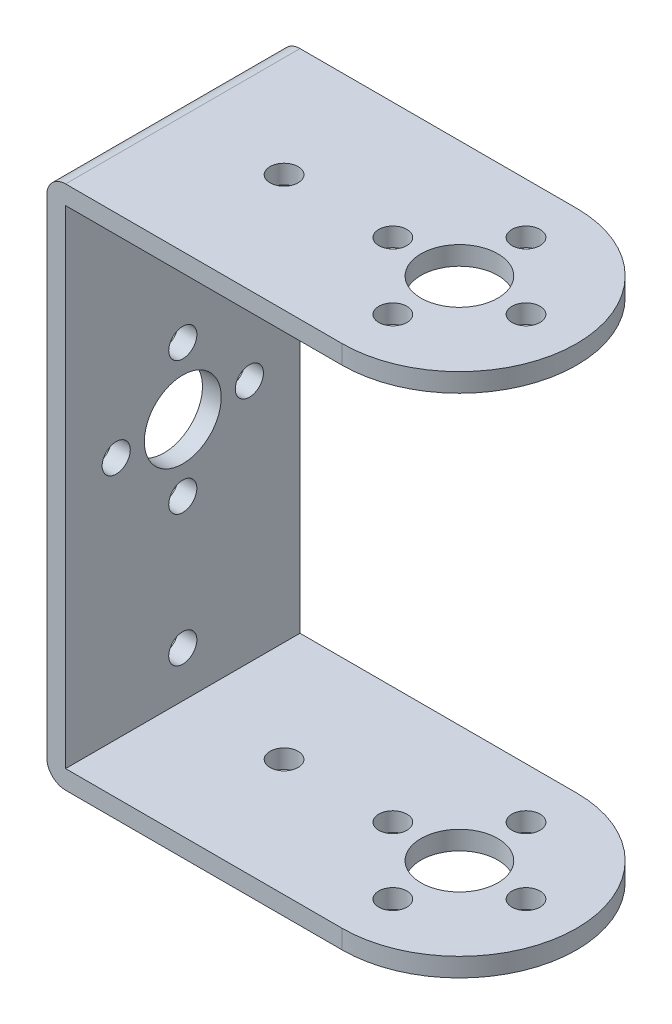
ISO-10303-21;
HEADER;
FILE_DESCRIPTION(('STEP AP214'),'2;1');
FILE_NAME('part.step','',(''),(''),'','','');
FILE_SCHEMA(('AUTOMOTIVE_DESIGN { 1 0 10303 214 1 1 1 1 }'));
ENDSEC;
DATA;
#1=APPLICATION_CONTEXT('core data for automotive mechanical design processes');
#2=APPLICATION_PROTOCOL_DEFINITION('international standard','automotive_design',2000,#1);
#3=PRODUCT_CONTEXT('',#1,'mechanical');
#4=PRODUCT('Part','Part','',(#3));
#5=PRODUCT_RELATED_PRODUCT_CATEGORY('part','',(#4));
#6=PRODUCT_DEFINITION_FORMATION('','',#4);
#7=PRODUCT_DEFINITION_CONTEXT('part definition',#1,'design');
#8=PRODUCT_DEFINITION('design','',#6,#7);
#9=PRODUCT_DEFINITION_SHAPE('','',#8);
#10=(LENGTH_UNIT() NAMED_UNIT(*) SI_UNIT(.MILLI.,.METRE.));
#11=(NAMED_UNIT(*) PLANE_ANGLE_UNIT() SI_UNIT($,.RADIAN.));
#12=(NAMED_UNIT(*) SI_UNIT($,.STERADIAN.) SOLID_ANGLE_UNIT());
#13=UNCERTAINTY_MEASURE_WITH_UNIT(LENGTH_MEASURE(1.E-05),#10,'distance_accuracy_value','');
#14=(GEOMETRIC_REPRESENTATION_CONTEXT(3) GLOBAL_UNCERTAINTY_ASSIGNED_CONTEXT((#13)) GLOBAL_UNIT_ASSIGNED_CONTEXT((#10,
#11,#12)) REPRESENTATION_CONTEXT('',''));
#15=CARTESIAN_POINT('',(0.,0.,0.));
#16=DIRECTION('',(0.,0.,1.));
#17=DIRECTION('',(1.,0.,0.));
#18=AXIS2_PLACEMENT_3D('',#15,#16,#17);
#19=CARTESIAN_POINT('',(-20.,-56.,-12.5));
#20=DIRECTION('',(1.,0.,0.));
#21=DIRECTION('',(0.,0.,-1.));
#22=AXIS2_PLACEMENT_3D('',#19,#20,#21);
#23=PLANE('',#22);
#24=CARTESIAN_POINT('',(-20.,-6.9,0.));
#25=DIRECTION('',(1.,0.,0.));
#26=DIRECTION('',(0.,0.,-1.));
#27=AXIS2_PLACEMENT_3D('',#24,#25,#26);
#28=CIRCLE('',#27,1.5);
#29=CARTESIAN_POINT('',(-20.,-6.9,-1.5));
#30=VERTEX_POINT('',#29);
#31=EDGE_CURVE('E473',#30,#30,#28,.F.);
#32=ORIENTED_EDGE('',*,*,#31,.T.);
#33=EDGE_LOOP('',(#32));
#34=FACE_BOUND('',#33,.T.);
#35=CARTESIAN_POINT('',(-20.,-28.,-7.1));
#36=DIRECTION('',(1.,0.,0.));
#37=DIRECTION('',(0.,0.,-1.));
#38=AXIS2_PLACEMENT_3D('',#35,#36,#37);
#39=CIRCLE('',#38,1.5);
#40=CARTESIAN_POINT('',(-20.,-28.,-8.6));
#41=VERTEX_POINT('',#40);
#42=EDGE_CURVE('E469',#41,#41,#39,.F.);
#43=ORIENTED_EDGE('',*,*,#42,.T.);
#44=EDGE_LOOP('',(#43));
#45=FACE_BOUND('',#44,.T.);
#46=CARTESIAN_POINT('',(-20.,-35.1,0.));
#47=DIRECTION('',(1.,0.,0.));
#48=DIRECTION('',(0.,0.,-1.));
#49=AXIS2_PLACEMENT_3D('',#46,#47,#48);
#50=CIRCLE('',#49,1.5);
#51=CARTESIAN_POINT('',(-20.,-35.1,-1.5));
#52=VERTEX_POINT('',#51);
#53=EDGE_CURVE('E463',#52,#52,#50,.F.);
#54=ORIENTED_EDGE('',*,*,#53,.T.);
#55=EDGE_LOOP('',(#54));
#56=FACE_BOUND('',#55,.T.);
#57=CARTESIAN_POINT('',(-20.,-28.,7.1));
#58=DIRECTION('',(1.,0.,0.));
#59=DIRECTION('',(0.,0.,-1.));
#60=AXIS2_PLACEMENT_3D('',#57,#58,#59);
#61=CIRCLE('',#60,1.5);
#62=CARTESIAN_POINT('',(-20.,-28.,5.6));
#63=VERTEX_POINT('',#62);
#64=EDGE_CURVE('E315',#63,#63,#61,.F.);
#65=ORIENTED_EDGE('',*,*,#64,.T.);
#66=EDGE_LOOP('',(#65));
#67=FACE_BOUND('',#66,.T.);
#68=CARTESIAN_POINT('',(-20.,-20.9,0.));
#69=DIRECTION('',(1.,0.,0.));
#70=DIRECTION('',(0.,0.,-1.));
#71=AXIS2_PLACEMENT_3D('',#68,#69,#70);
#72=CIRCLE('',#71,1.5);
#73=CARTESIAN_POINT('',(-20.,-20.9,-1.5));
#74=VERTEX_POINT('',#73);
#75=EDGE_CURVE('E480',#74,#74,#72,.F.);
#76=ORIENTED_EDGE('',*,*,#75,.T.);
#77=EDGE_LOOP('',(#76));
#78=FACE_BOUND('',#77,.T.);
#79=CARTESIAN_POINT('',(-20.,-49.1,0.));
#80=DIRECTION('',(1.,0.,0.));
#81=DIRECTION('',(0.,0.,-1.));
#82=AXIS2_PLACEMENT_3D('',#79,#80,#81);
#83=CIRCLE('',#82,1.5);
#84=CARTESIAN_POINT('',(-20.,-49.1,-1.5));
#85=VERTEX_POINT('',#84);
#86=EDGE_CURVE('E476',#85,#85,#83,.F.);
#87=ORIENTED_EDGE('',*,*,#86,.T.);
#88=EDGE_LOOP('',(#87));
#89=FACE_BOUND('',#88,.T.);
#90=CARTESIAN_POINT('',(-20.,-28.,0.));
#91=DIRECTION('',(1.,0.,0.));
#92=DIRECTION('',(0.,0.,-1.));
#93=AXIS2_PLACEMENT_3D('',#90,#91,#92);
#94=CIRCLE('',#93,4.1);
#95=CARTESIAN_POINT('',(-20.,-28.,-4.1));
#96=VERTEX_POINT('',#95);
#97=EDGE_CURVE('E307',#96,#96,#94,.F.);
#98=ORIENTED_EDGE('',*,*,#97,.T.);
#99=EDGE_LOOP('',(#98));
#100=FACE_BOUND('',#99,.T.);
#101=DIRECTION('',(0.,1.,0.));
#102=VECTOR('',#101,1.);
#103=CARTESIAN_POINT('',(-20.,-56.,12.5));
#104=LINE('',#103,#102);
#105=CARTESIAN_POINT('',(-20.,-54.,12.5));
#106=VERTEX_POINT('',#105);
#107=CARTESIAN_POINT('',(-20.,-2.,12.5));
#108=VERTEX_POINT('',#107);
#109=EDGE_CURVE('E185',#106,#108,#104,.T.);
#110=ORIENTED_EDGE('',*,*,#109,.F.);
#111=DIRECTION('',(0.,0.,-1.));
#112=VECTOR('',#111,1.);
#113=CARTESIAN_POINT('',(-20.,-54.,0.));
#114=LINE('',#113,#112);
#115=CARTESIAN_POINT('',(-20.,-54.,-12.5));
#116=VERTEX_POINT('',#115);
#117=EDGE_CURVE('E350',#106,#116,#114,.T.);
#118=ORIENTED_EDGE('',*,*,#117,.T.);
#119=DIRECTION('',(0.,1.,0.));
#120=VECTOR('',#119,1.);
#121=CARTESIAN_POINT('',(-20.,-56.,-12.5));
#122=LINE('',#121,#120);
#123=CARTESIAN_POINT('',(-20.,-2.,-12.5));
#124=VERTEX_POINT('',#123);
#125=EDGE_CURVE('E186',#116,#124,#122,.T.);
#126=ORIENTED_EDGE('',*,*,#125,.T.);
#127=DIRECTION('',(0.,0.,-1.));
#128=VECTOR('',#127,1.);
#129=CARTESIAN_POINT('',(-20.,-2.,0.));
#130=LINE('',#129,#128);
#131=EDGE_CURVE('E188',#108,#124,#130,.T.);
#132=ORIENTED_EDGE('',*,*,#131,.F.);
#133=EDGE_LOOP('',(#110,#118,#126,#132));
#134=FACE_BOUND('',#133,.T.);
#135=ADVANCED_FACE('F37',(#34,#45,#56,#67,#78,#89,#100,#134),#23,.T.);
#136=CARTESIAN_POINT('',(9.5,-2.,0.));
#137=DIRECTION('',(0.,1.,0.));
#138=DIRECTION('',(0.,0.,1.));
#139=AXIS2_PLACEMENT_3D('',#136,#137,#138);
#140=CYLINDRICAL_SURFACE('',#139,12.5);
#141=DIRECTION('',(0.,1.,0.));
#142=VECTOR('',#141,1.);
#143=CARTESIAN_POINT('',(9.5,-2.,12.5));
#144=LINE('',#143,#142);
#145=CARTESIAN_POINT('',(9.5,-2.,12.5));
#146=VERTEX_POINT('',#145);
#147=CARTESIAN_POINT('',(9.5,0.,12.5));
#148=VERTEX_POINT('',#147);
#149=EDGE_CURVE('E205',#146,#148,#144,.T.);
#150=ORIENTED_EDGE('',*,*,#149,.F.);
#151=CARTESIAN_POINT('',(9.5,-2.,0.));
#152=DIRECTION('',(0.,1.,0.));
#153=DIRECTION('',(0.,0.,1.));
#154=AXIS2_PLACEMENT_3D('',#151,#152,#153);
#155=CIRCLE('',#154,12.5);
#156=CARTESIAN_POINT('',(9.49999999999999,-2.,-12.5));
#157=VERTEX_POINT('',#156);
#158=EDGE_CURVE('E213',#157,#146,#155,.F.);
#159=ORIENTED_EDGE('',*,*,#158,.F.);
#160=DIRECTION('',(0.,1.,0.));
#161=VECTOR('',#160,1.);
#162=CARTESIAN_POINT('',(9.5,-2.,-12.5));
#163=LINE('',#162,#161);
#164=CARTESIAN_POINT('',(9.49999999999999,0.,-12.5));
#165=VERTEX_POINT('',#164);
#166=EDGE_CURVE('E210',#165,#157,#163,.F.);
#167=ORIENTED_EDGE('',*,*,#166,.F.);
#168=CARTESIAN_POINT('',(9.5,0.,0.));
#169=DIRECTION('',(0.,1.,0.));
#170=DIRECTION('',(0.,0.,1.));
#171=AXIS2_PLACEMENT_3D('',#168,#169,#170);
#172=CIRCLE('',#171,12.5);
#173=EDGE_CURVE('E215',#148,#165,#172,.T.);
#174=ORIENTED_EDGE('',*,*,#173,.F.);
#175=EDGE_LOOP('',(#150,#159,#167,#174));
#176=FACE_BOUND('',#175,.T.);
#177=ADVANCED_FACE('F247',(#176),#140,.T.);
#178=CARTESIAN_POINT('',(-22.,-2.,12.5));
#179=DIRECTION('',(-1.,0.,0.));
#180=DIRECTION('',(0.,0.,1.));
#181=AXIS2_PLACEMENT_3D('',#178,#179,#180);
#182=PLANE('',#181);
#183=CARTESIAN_POINT('',(-22.,-6.9,0.));
#184=DIRECTION('',(-1.,0.,0.));
#185=DIRECTION('',(0.,0.,1.));
#186=AXIS2_PLACEMENT_3D('',#183,#184,#185);
#187=CIRCLE('',#186,1.5);
#188=CARTESIAN_POINT('',(-22.,-6.9,1.5));
#189=VERTEX_POINT('',#188);
#190=EDGE_CURVE('E281',#189,#189,#187,.T.);
#191=ORIENTED_EDGE('',*,*,#190,.F.);
#192=EDGE_LOOP('',(#191));
#193=FACE_BOUND('',#192,.T.);
#194=CARTESIAN_POINT('',(-22.,-28.,-7.1));
#195=DIRECTION('',(-1.,0.,0.));
#196=DIRECTION('',(0.,0.,1.));
#197=AXIS2_PLACEMENT_3D('',#194,#195,#196);
#198=CIRCLE('',#197,1.5);
#199=CARTESIAN_POINT('',(-22.,-28.,-5.59999999999999));
#200=VERTEX_POINT('',#199);
#201=EDGE_CURVE('E285',#200,#200,#198,.T.);
#202=ORIENTED_EDGE('',*,*,#201,.F.);
#203=EDGE_LOOP('',(#202));
#204=FACE_BOUND('',#203,.T.);
#205=CARTESIAN_POINT('',(-22.,-35.1,0.));
#206=DIRECTION('',(-1.,0.,0.));
#207=DIRECTION('',(0.,0.,1.));
#208=AXIS2_PLACEMENT_3D('',#205,#206,#207);
#209=CIRCLE('',#208,1.5);
#210=CARTESIAN_POINT('',(-22.,-35.1,1.50000000000001));
#211=VERTEX_POINT('',#210);
#212=EDGE_CURVE('E289',#211,#211,#209,.T.);
#213=ORIENTED_EDGE('',*,*,#212,.F.);
#214=EDGE_LOOP('',(#213));
#215=FACE_BOUND('',#214,.T.);
#216=CARTESIAN_POINT('',(-22.,-28.,7.1));
#217=DIRECTION('',(-1.,0.,0.));
#218=DIRECTION('',(0.,0.,1.));
#219=AXIS2_PLACEMENT_3D('',#216,#217,#218);
#220=CIRCLE('',#219,1.5);
#221=CARTESIAN_POINT('',(-22.,-28.,8.6));
#222=VERTEX_POINT('',#221);
#223=EDGE_CURVE('E293',#222,#222,#220,.T.);
#224=ORIENTED_EDGE('',*,*,#223,.F.);
#225=EDGE_LOOP('',(#224));
#226=FACE_BOUND('',#225,.T.);
#227=CARTESIAN_POINT('',(-22.,-20.9,0.));
#228=DIRECTION('',(-1.,0.,0.));
#229=DIRECTION('',(0.,0.,1.));
#230=AXIS2_PLACEMENT_3D('',#227,#228,#229);
#231=CIRCLE('',#230,1.5);
#232=CARTESIAN_POINT('',(-22.,-20.9,1.5));
#233=VERTEX_POINT('',#232);
#234=EDGE_CURVE('E297',#233,#233,#231,.T.);
#235=ORIENTED_EDGE('',*,*,#234,.F.);
#236=EDGE_LOOP('',(#235));
#237=FACE_BOUND('',#236,.T.);
#238=CARTESIAN_POINT('',(-22.,-49.1,0.));
#239=DIRECTION('',(-1.,0.,0.));
#240=DIRECTION('',(0.,0.,-1.));
#241=AXIS2_PLACEMENT_3D('',#238,#239,#240);
#242=CIRCLE('',#241,1.5);
#243=CARTESIAN_POINT('',(-22.,-49.1,-1.5));
#244=VERTEX_POINT('',#243);
#245=EDGE_CURVE('E301',#244,#244,#242,.T.);
#246=ORIENTED_EDGE('',*,*,#245,.F.);
#247=EDGE_LOOP('',(#246));
#248=FACE_BOUND('',#247,.T.);
#249=CARTESIAN_POINT('',(-22.,-28.,0.));
#250=DIRECTION('',(-1.,0.,0.));
#251=DIRECTION('',(0.,0.,1.));
#252=AXIS2_PLACEMENT_3D('',#249,#250,#251);
#253=CIRCLE('',#252,4.1);
#254=CARTESIAN_POINT('',(-22.,-28.,4.1));
#255=VERTEX_POINT('',#254);
#256=EDGE_CURVE('E304',#255,#255,#253,.T.);
#257=ORIENTED_EDGE('',*,*,#256,.F.);
#258=EDGE_LOOP('',(#257));
#259=FACE_BOUND('',#258,.T.);
#260=DIRECTION('',(0.,1.,0.));
#261=VECTOR('',#260,1.);
#262=CARTESIAN_POINT('',(-22.,-2.,-12.5));
#263=LINE('',#262,#261);
#264=CARTESIAN_POINT('',(-22.,-54.,-12.5));
#265=VERTEX_POINT('',#264);
#266=CARTESIAN_POINT('',(-22.,-2.,-12.5));
#267=VERTEX_POINT('',#266);
#268=EDGE_CURVE('E203',#265,#267,#263,.T.);
#269=ORIENTED_EDGE('',*,*,#268,.F.);
#270=DIRECTION('',(0.,0.,1.));
#271=VECTOR('',#270,1.);
#272=CARTESIAN_POINT('',(-22.,-54.,12.5));
#273=LINE('',#272,#271);
#274=CARTESIAN_POINT('',(-22.,-54.,12.5));
#275=VERTEX_POINT('',#274);
#276=EDGE_CURVE('E219',#265,#275,#273,.T.);
#277=ORIENTED_EDGE('',*,*,#276,.T.);
#278=DIRECTION('',(0.,1.,0.));
#279=VECTOR('',#278,1.);
#280=CARTESIAN_POINT('',(-22.,-2.,12.5));
#281=LINE('',#280,#279);
#282=CARTESIAN_POINT('',(-22.,-2.,12.5));
#283=VERTEX_POINT('',#282);
#284=EDGE_CURVE('E200',#275,#283,#281,.T.);
#285=ORIENTED_EDGE('',*,*,#284,.T.);
#286=DIRECTION('',(0.,0.,1.));
#287=VECTOR('',#286,1.);
#288=CARTESIAN_POINT('',(-22.,-2.,12.5));
#289=LINE('',#288,#287);
#290=EDGE_CURVE('E217',#283,#267,#289,.F.);
#291=ORIENTED_EDGE('',*,*,#290,.T.);
#292=EDGE_LOOP('',(#269,#277,#285,#291));
#293=FACE_BOUND('',#292,.T.);
#294=ADVANCED_FACE('F232',(#193,#204,#215,#226,#237,#248,#259,#293),#182,.T.);
#295=CARTESIAN_POINT('',(22.,-2.,-12.5));
#296=DIRECTION('',(0.,0.,-1.));
#297=DIRECTION('',(-1.,0.,0.));
#298=AXIS2_PLACEMENT_3D('',#295,#296,#297);
#299=PLANE('',#298);
#300=DIRECTION('',(-1.,0.,0.));
#301=VECTOR('',#300,1.);
#302=CARTESIAN_POINT('',(-22.,-56.,-12.5));
#303=LINE('',#302,#301);
#304=CARTESIAN_POINT('',(9.49999999999999,-56.,-12.5));
#305=VERTEX_POINT('',#304);
#306=CARTESIAN_POINT('',(-20.,-56.,-12.5));
#307=VERTEX_POINT('',#306);
#308=EDGE_CURVE('E124',#305,#307,#303,.T.);
#309=ORIENTED_EDGE('',*,*,#308,.T.);
#310=CARTESIAN_POINT('',(-20.,-54.,-12.5));
#311=DIRECTION('',(0.,0.,-1.));
#312=DIRECTION('',(-1.,0.,0.));
#313=AXIS2_PLACEMENT_3D('',#310,#311,#312);
#314=CIRCLE('',#313,2.);
#315=EDGE_CURVE('E45',#307,#265,#314,.T.);
#316=ORIENTED_EDGE('',*,*,#315,.T.);
#317=ORIENTED_EDGE('',*,*,#268,.T.);
#318=CARTESIAN_POINT('',(-20.,-2.,-12.5));
#319=DIRECTION('',(0.,0.,-1.));
#320=DIRECTION('',(-1.,0.,0.));
#321=AXIS2_PLACEMENT_3D('',#318,#319,#320);
#322=CIRCLE('',#321,2.);
#323=CARTESIAN_POINT('',(-20.,0.,-12.5));
#324=VERTEX_POINT('',#323);
#325=EDGE_CURVE('E52',#267,#324,#322,.T.);
#326=ORIENTED_EDGE('',*,*,#325,.T.);
#327=DIRECTION('',(-1.,0.,0.));
#328=VECTOR('',#327,1.);
#329=CARTESIAN_POINT('',(22.,0.,-12.5));
#330=LINE('',#329,#328);
#331=EDGE_CURVE('E197',#165,#324,#330,.T.);
#332=ORIENTED_EDGE('',*,*,#331,.F.);
#333=ORIENTED_EDGE('',*,*,#166,.T.);
#334=DIRECTION('',(-1.,0.,0.));
#335=VECTOR('',#334,1.);
#336=CARTESIAN_POINT('',(22.,-2.,-12.5));
#337=LINE('',#336,#335);
#338=EDGE_CURVE('E196',#157,#124,#337,.T.);
#339=ORIENTED_EDGE('',*,*,#338,.T.);
#340=ORIENTED_EDGE('',*,*,#125,.F.);
#341=DIRECTION('',(-1.,0.,0.));
#342=VECTOR('',#341,1.);
#343=CARTESIAN_POINT('',(22.,-54.,-12.5));
#344=LINE('',#343,#342);
#345=CARTESIAN_POINT('',(9.49999999999999,-54.,-12.5));
#346=VERTEX_POINT('',#345);
#347=EDGE_CURVE('E141',#346,#116,#344,.T.);
#348=ORIENTED_EDGE('',*,*,#347,.F.);
#349=DIRECTION('',(0.,-1.,0.));
#350=VECTOR('',#349,1.);
#351=CARTESIAN_POINT('',(9.5,-54.,-12.5));
#352=LINE('',#351,#350);
#353=EDGE_CURVE('E140',#305,#346,#352,.F.);
#354=ORIENTED_EDGE('',*,*,#353,.F.);
#355=EDGE_LOOP('',(#309,#316,#317,#326,#332,#333,#339,#340,#348,#354));
#356=FACE_BOUND('',#355,.T.);
#357=ADVANCED_FACE('F228',(#356),#299,.T.);
#358=CARTESIAN_POINT('',(22.,-2.,12.5));
#359=DIRECTION('',(0.,0.,1.));
#360=DIRECTION('',(1.,0.,0.));
#361=AXIS2_PLACEMENT_3D('',#358,#359,#360);
#362=PLANE('',#361);
#363=ORIENTED_EDGE('',*,*,#284,.F.);
#364=CARTESIAN_POINT('',(-20.,-54.,12.5));
#365=DIRECTION('',(0.,0.,1.));
#366=DIRECTION('',(1.,0.,0.));
#367=AXIS2_PLACEMENT_3D('',#364,#365,#366);
#368=CIRCLE('',#367,2.);
#369=CARTESIAN_POINT('',(-20.,-56.,12.5));
#370=VERTEX_POINT('',#369);
#371=EDGE_CURVE('E123',#275,#370,#368,.T.);
#372=ORIENTED_EDGE('',*,*,#371,.T.);
#373=DIRECTION('',(1.,0.,0.));
#374=VECTOR('',#373,1.);
#375=CARTESIAN_POINT('',(-22.,-56.,12.5));
#376=LINE('',#375,#374);
#377=CARTESIAN_POINT('',(9.5,-56.,12.5));
#378=VERTEX_POINT('',#377);
#379=EDGE_CURVE('E116',#370,#378,#376,.T.);
#380=ORIENTED_EDGE('',*,*,#379,.T.);
#381=DIRECTION('',(0.,-1.,0.));
#382=VECTOR('',#381,1.);
#383=CARTESIAN_POINT('',(9.5,-54.,12.5));
#384=LINE('',#383,#382);
#385=CARTESIAN_POINT('',(9.5,-54.,12.5));
#386=VERTEX_POINT('',#385);
#387=EDGE_CURVE('E122',#386,#378,#384,.T.);
#388=ORIENTED_EDGE('',*,*,#387,.F.);
#389=DIRECTION('',(1.,0.,0.));
#390=VECTOR('',#389,1.);
#391=CARTESIAN_POINT('',(22.,-54.,12.5));
#392=LINE('',#391,#390);
#393=EDGE_CURVE('E145',#106,#386,#392,.T.);
#394=ORIENTED_EDGE('',*,*,#393,.F.);
#395=ORIENTED_EDGE('',*,*,#109,.T.);
#396=DIRECTION('',(1.,0.,0.));
#397=VECTOR('',#396,1.);
#398=CARTESIAN_POINT('',(22.,-2.,12.5));
#399=LINE('',#398,#397);
#400=EDGE_CURVE('E193',#108,#146,#399,.T.);
#401=ORIENTED_EDGE('',*,*,#400,.T.);
#402=ORIENTED_EDGE('',*,*,#149,.T.);
#403=DIRECTION('',(1.,0.,0.));
#404=VECTOR('',#403,1.);
#405=CARTESIAN_POINT('',(22.,0.,12.5));
#406=LINE('',#405,#404);
#407=CARTESIAN_POINT('',(-20.,0.,12.5));
#408=VERTEX_POINT('',#407);
#409=EDGE_CURVE('E192',#408,#148,#406,.T.);
#410=ORIENTED_EDGE('',*,*,#409,.F.);
#411=CARTESIAN_POINT('',(-20.,-2.,12.5));
#412=DIRECTION('',(0.,0.,1.));
#413=DIRECTION('',(1.,0.,0.));
#414=AXIS2_PLACEMENT_3D('',#411,#412,#413);
#415=CIRCLE('',#414,2.);
#416=EDGE_CURVE('E222',#408,#283,#415,.T.);
#417=ORIENTED_EDGE('',*,*,#416,.T.);
#418=EDGE_LOOP('',(#363,#372,#380,#388,#394,#395,#401,#402,#410,#417));
#419=FACE_BOUND('',#418,.T.);
#420=ADVANCED_FACE('F119',(#419),#362,.T.);
#421=CARTESIAN_POINT('',(0.,-2.,0.));
#422=DIRECTION('',(0.,1.,0.));
#423=DIRECTION('',(0.,0.,1.));
#424=AXIS2_PLACEMENT_3D('',#421,#422,#423);
#425=PLANE('',#424);
#426=CARTESIAN_POINT('',(-9.2,-2.,0.));
#427=DIRECTION('',(0.,1.,0.));
#428=DIRECTION('',(0.,0.,1.));
#429=AXIS2_PLACEMENT_3D('',#426,#427,#428);
#430=CIRCLE('',#429,1.5);
#431=CARTESIAN_POINT('',(-9.2,-2.,1.5));
#432=VERTEX_POINT('',#431);
#433=EDGE_CURVE('E161',#432,#432,#430,.F.);
#434=ORIENTED_EDGE('',*,*,#433,.F.);
#435=EDGE_LOOP('',(#434));
#436=FACE_BOUND('',#435,.T.);
#437=CARTESIAN_POINT('',(9.5,-2.,7.1));
#438=DIRECTION('',(0.,1.,0.));
#439=DIRECTION('',(0.,0.,1.));
#440=AXIS2_PLACEMENT_3D('',#437,#438,#439);
#441=CIRCLE('',#440,1.5);
#442=CARTESIAN_POINT('',(9.5,-2.,8.6));
#443=VERTEX_POINT('',#442);
#444=EDGE_CURVE('E154',#443,#443,#441,.F.);
#445=ORIENTED_EDGE('',*,*,#444,.F.);
#446=EDGE_LOOP('',(#445));
#447=FACE_BOUND('',#446,.T.);
#448=CARTESIAN_POINT('',(16.6,-2.,0.));
#449=DIRECTION('',(0.,1.,0.));
#450=DIRECTION('',(0.,0.,1.));
#451=AXIS2_PLACEMENT_3D('',#448,#449,#450);
#452=CIRCLE('',#451,1.5);
#453=CARTESIAN_POINT('',(16.6,-2.,1.5));
#454=VERTEX_POINT('',#453);
#455=EDGE_CURVE('E153',#454,#454,#452,.F.);
#456=ORIENTED_EDGE('',*,*,#455,.F.);
#457=EDGE_LOOP('',(#456));
#458=FACE_BOUND('',#457,.T.);
#459=CARTESIAN_POINT('',(9.5,-2.,-7.1));
#460=DIRECTION('',(0.,1.,0.));
#461=DIRECTION('',(0.,0.,1.));
#462=AXIS2_PLACEMENT_3D('',#459,#460,#461);
#463=CIRCLE('',#462,1.5);
#464=CARTESIAN_POINT('',(9.5,-2.,-5.6));
#465=VERTEX_POINT('',#464);
#466=EDGE_CURVE('E172',#465,#465,#463,.F.);
#467=ORIENTED_EDGE('',*,*,#466,.F.);
#468=EDGE_LOOP('',(#467));
#469=FACE_BOUND('',#468,.T.);
#470=CARTESIAN_POINT('',(2.4,-2.,0.));
#471=DIRECTION('',(0.,1.,0.));
#472=DIRECTION('',(0.,0.,1.));
#473=AXIS2_PLACEMENT_3D('',#470,#471,#472);
#474=CIRCLE('',#473,1.5);
#475=CARTESIAN_POINT('',(2.4,-2.,1.5));
#476=VERTEX_POINT('',#475);
#477=EDGE_CURVE('E171',#476,#476,#474,.F.);
#478=ORIENTED_EDGE('',*,*,#477,.F.);
#479=EDGE_LOOP('',(#478));
#480=FACE_BOUND('',#479,.T.);
#481=CARTESIAN_POINT('',(9.5,-2.,0.));
#482=DIRECTION('',(0.,1.,0.));
#483=DIRECTION('',(0.,0.,1.));
#484=AXIS2_PLACEMENT_3D('',#481,#482,#483);
#485=CIRCLE('',#484,4.1);
#486=CARTESIAN_POINT('',(9.5,-2.,4.1));
#487=VERTEX_POINT('',#486);
#488=EDGE_CURVE('E125',#487,#487,#485,.F.);
#489=ORIENTED_EDGE('',*,*,#488,.F.);
#490=EDGE_LOOP('',(#489));
#491=FACE_BOUND('',#490,.T.);
#492=ORIENTED_EDGE('',*,*,#338,.F.);
#493=ORIENTED_EDGE('',*,*,#158,.T.);
#494=ORIENTED_EDGE('',*,*,#400,.F.);
#495=ORIENTED_EDGE('',*,*,#131,.T.);
#496=EDGE_LOOP('',(#492,#493,#494,#495));
#497=FACE_BOUND('',#496,.T.);
#498=ADVANCED_FACE('F259',(#436,#447,#458,#469,#480,#491,#497),#425,.F.);
#499=CARTESIAN_POINT('',(0.,0.,0.));
#500=DIRECTION('',(0.,1.,0.));
#501=DIRECTION('',(0.,0.,1.));
#502=AXIS2_PLACEMENT_3D('',#499,#500,#501);
#503=PLANE('',#502);
#504=ORIENTED_EDGE('',*,*,#331,.T.);
#505=DIRECTION('',(0.,0.,1.));
#506=VECTOR('',#505,1.);
#507=CARTESIAN_POINT('',(-20.,0.,0.));
#508=LINE('',#507,#506);
#509=EDGE_CURVE('E11',#324,#408,#508,.T.);
#510=ORIENTED_EDGE('',*,*,#509,.T.);
#511=ORIENTED_EDGE('',*,*,#409,.T.);
#512=ORIENTED_EDGE('',*,*,#173,.T.);
#513=EDGE_LOOP('',(#504,#510,#511,#512));
#514=FACE_BOUND('',#513,.T.);
#515=CARTESIAN_POINT('',(-9.2,0.,0.));
#516=DIRECTION('',(0.,1.,0.));
#517=DIRECTION('',(0.,0.,1.));
#518=AXIS2_PLACEMENT_3D('',#515,#516,#517);
#519=CIRCLE('',#518,1.5);
#520=CARTESIAN_POINT('',(-9.2,0.,1.5));
#521=VERTEX_POINT('',#520);
#522=EDGE_CURVE('E134',#521,#521,#519,.T.);
#523=ORIENTED_EDGE('',*,*,#522,.F.);
#524=EDGE_LOOP('',(#523));
#525=FACE_BOUND('',#524,.T.);
#526=CARTESIAN_POINT('',(9.5,0.,7.1));
#527=DIRECTION('',(0.,1.,0.));
#528=DIRECTION('',(0.,0.,1.));
#529=AXIS2_PLACEMENT_3D('',#526,#527,#528);
#530=CIRCLE('',#529,1.5);
#531=CARTESIAN_POINT('',(9.5,0.,8.6));
#532=VERTEX_POINT('',#531);
#533=EDGE_CURVE('E158',#532,#532,#530,.T.);
#534=ORIENTED_EDGE('',*,*,#533,.F.);
#535=EDGE_LOOP('',(#534));
#536=FACE_BOUND('',#535,.T.);
#537=CARTESIAN_POINT('',(16.6,0.,0.));
#538=DIRECTION('',(0.,1.,0.));
#539=DIRECTION('',(0.,0.,1.));
#540=AXIS2_PLACEMENT_3D('',#537,#538,#539);
#541=CIRCLE('',#540,1.5);
#542=CARTESIAN_POINT('',(16.6,0.,1.5));
#543=VERTEX_POINT('',#542);
#544=EDGE_CURVE('E150',#543,#543,#541,.T.);
#545=ORIENTED_EDGE('',*,*,#544,.F.);
#546=EDGE_LOOP('',(#545));
#547=FACE_BOUND('',#546,.T.);
#548=CARTESIAN_POINT('',(9.5,0.,-7.1));
#549=DIRECTION('',(0.,1.,0.));
#550=DIRECTION('',(0.,0.,1.));
#551=AXIS2_PLACEMENT_3D('',#548,#549,#550);
#552=CIRCLE('',#551,1.5);
#553=CARTESIAN_POINT('',(9.5,0.,-5.6));
#554=VERTEX_POINT('',#553);
#555=EDGE_CURVE('E157',#554,#554,#552,.T.);
#556=ORIENTED_EDGE('',*,*,#555,.F.);
#557=EDGE_LOOP('',(#556));
#558=FACE_BOUND('',#557,.T.);
#559=CARTESIAN_POINT('',(2.4,0.,0.));
#560=DIRECTION('',(0.,1.,0.));
#561=DIRECTION('',(0.,0.,1.));
#562=AXIS2_PLACEMENT_3D('',#559,#560,#561);
#563=CIRCLE('',#562,1.5);
#564=CARTESIAN_POINT('',(2.4,0.,1.5));
#565=VERTEX_POINT('',#564);
#566=EDGE_CURVE('E168',#565,#565,#563,.T.);
#567=ORIENTED_EDGE('',*,*,#566,.F.);
#568=EDGE_LOOP('',(#567));
#569=FACE_BOUND('',#568,.T.);
#570=CARTESIAN_POINT('',(9.5,0.,0.));
#571=DIRECTION('',(0.,1.,0.));
#572=DIRECTION('',(0.,0.,1.));
#573=AXIS2_PLACEMENT_3D('',#570,#571,#572);
#574=CIRCLE('',#573,4.1);
#575=CARTESIAN_POINT('',(9.5,0.,4.1));
#576=VERTEX_POINT('',#575);
#577=EDGE_CURVE('E175',#576,#576,#574,.T.);
#578=ORIENTED_EDGE('',*,*,#577,.F.);
#579=EDGE_LOOP('',(#578));
#580=FACE_BOUND('',#579,.T.);
#581=ADVANCED_FACE('F262',(#514,#525,#536,#547,#558,#569,#580),#503,.T.);
#582=CARTESIAN_POINT('',(0.,-56.,0.));
#583=DIRECTION('',(0.,1.,0.));
#584=DIRECTION('',(0.,0.,1.));
#585=AXIS2_PLACEMENT_3D('',#582,#583,#584);
#586=PLANE('',#585);
#587=ORIENTED_EDGE('',*,*,#379,.F.);
#588=DIRECTION('',(0.,0.,1.));
#589=VECTOR('',#588,1.);
#590=CARTESIAN_POINT('',(-20.,-56.,-12.5));
#591=LINE('',#590,#589);
#592=EDGE_CURVE('E60',#370,#307,#591,.F.);
#593=ORIENTED_EDGE('',*,*,#592,.T.);
#594=ORIENTED_EDGE('',*,*,#308,.F.);
#595=CARTESIAN_POINT('',(9.5,-56.,0.));
#596=DIRECTION('',(0.,1.,0.));
#597=DIRECTION('',(0.,0.,1.));
#598=AXIS2_PLACEMENT_3D('',#595,#596,#597);
#599=CIRCLE('',#598,12.5);
#600=EDGE_CURVE('E128',#378,#305,#599,.T.);
#601=ORIENTED_EDGE('',*,*,#600,.F.);
#602=EDGE_LOOP('',(#587,#593,#594,#601));
#603=FACE_BOUND('',#602,.T.);
#604=CARTESIAN_POINT('',(-9.2,-56.,0.));
#605=DIRECTION('',(0.,1.,0.));
#606=DIRECTION('',(0.,0.,1.));
#607=AXIS2_PLACEMENT_3D('',#604,#605,#606);
#608=CIRCLE('',#607,1.5);
#609=CARTESIAN_POINT('',(-9.2,-56.,1.5));
#610=VERTEX_POINT('',#609);
#611=EDGE_CURVE('E306',#610,#610,#608,.T.);
#612=ORIENTED_EDGE('',*,*,#611,.T.);
#613=EDGE_LOOP('',(#612));
#614=FACE_BOUND('',#613,.T.);
#615=CARTESIAN_POINT('',(9.5,-56.,7.1));
#616=DIRECTION('',(0.,1.,0.));
#617=DIRECTION('',(0.,0.,1.));
#618=AXIS2_PLACEMENT_3D('',#615,#616,#617);
#619=CIRCLE('',#618,1.5);
#620=CARTESIAN_POINT('',(9.5,-56.,8.6));
#621=VERTEX_POINT('',#620);
#622=EDGE_CURVE('E326',#621,#621,#619,.T.);
#623=ORIENTED_EDGE('',*,*,#622,.T.);
#624=EDGE_LOOP('',(#623));
#625=FACE_BOUND('',#624,.T.);
#626=CARTESIAN_POINT('',(16.6,-56.,0.));
#627=DIRECTION('',(0.,1.,0.));
#628=DIRECTION('',(0.,0.,1.));
#629=AXIS2_PLACEMENT_3D('',#626,#627,#628);
#630=CIRCLE('',#629,1.5);
#631=CARTESIAN_POINT('',(16.6,-56.,1.5));
#632=VERTEX_POINT('',#631);
#633=EDGE_CURVE('E318',#632,#632,#630,.T.);
#634=ORIENTED_EDGE('',*,*,#633,.T.);
#635=EDGE_LOOP('',(#634));
#636=FACE_BOUND('',#635,.T.);
#637=CARTESIAN_POINT('',(9.5,-56.,-7.1));
#638=DIRECTION('',(0.,1.,0.));
#639=DIRECTION('',(0.,0.,1.));
#640=AXIS2_PLACEMENT_3D('',#637,#638,#639);
#641=CIRCLE('',#640,1.5);
#642=CARTESIAN_POINT('',(9.5,-56.,-5.6));
#643=VERTEX_POINT('',#642);
#644=EDGE_CURVE('E325',#643,#643,#641,.T.);
#645=ORIENTED_EDGE('',*,*,#644,.T.);
#646=EDGE_LOOP('',(#645));
#647=FACE_BOUND('',#646,.T.);
#648=CARTESIAN_POINT('',(2.4,-56.,0.));
#649=DIRECTION('',(0.,1.,0.));
#650=DIRECTION('',(0.,0.,1.));
#651=AXIS2_PLACEMENT_3D('',#648,#649,#650);
#652=CIRCLE('',#651,1.5);
#653=CARTESIAN_POINT('',(2.4,-56.,1.5));
#654=VERTEX_POINT('',#653);
#655=EDGE_CURVE('E333',#654,#654,#652,.T.);
#656=ORIENTED_EDGE('',*,*,#655,.T.);
#657=EDGE_LOOP('',(#656));
#658=FACE_BOUND('',#657,.T.);
#659=CARTESIAN_POINT('',(9.5,-56.,0.));
#660=DIRECTION('',(0.,1.,0.));
#661=DIRECTION('',(0.,0.,1.));
#662=AXIS2_PLACEMENT_3D('',#659,#660,#661);
#663=CIRCLE('',#662,4.1);
#664=CARTESIAN_POINT('',(9.5,-56.,4.1));
#665=VERTEX_POINT('',#664);
#666=EDGE_CURVE('E340',#665,#665,#663,.T.);
#667=ORIENTED_EDGE('',*,*,#666,.T.);
#668=EDGE_LOOP('',(#667));
#669=FACE_BOUND('',#668,.T.);
#670=ADVANCED_FACE('F129',(#603,#614,#625,#636,#647,#658,#669),#586,.F.);
#671=CARTESIAN_POINT('',(9.5,-56.001,0.));
#672=DIRECTION('',(0.,1.,0.));
#673=DIRECTION('',(0.,0.,1.));
#674=AXIS2_PLACEMENT_3D('',#671,#672,#673);
#675=CYLINDRICAL_SURFACE('',#674,4.1);
#676=ORIENTED_EDGE('',*,*,#577,.T.);
#677=EDGE_LOOP('',(#676));
#678=FACE_BOUND('',#677,.T.);
#679=ORIENTED_EDGE('',*,*,#488,.T.);
#680=EDGE_LOOP('',(#679));
#681=FACE_BOUND('',#680,.T.);
#682=ADVANCED_FACE('F378',(#678,#681),#675,.F.);
#683=CARTESIAN_POINT('',(2.4,-56.001,0.));
#684=DIRECTION('',(0.,1.,0.));
#685=DIRECTION('',(0.,0.,1.));
#686=AXIS2_PLACEMENT_3D('',#683,#684,#685);
#687=CYLINDRICAL_SURFACE('',#686,1.5);
#688=ORIENTED_EDGE('',*,*,#566,.T.);
#689=EDGE_LOOP('',(#688));
#690=FACE_BOUND('',#689,.T.);
#691=ORIENTED_EDGE('',*,*,#477,.T.);
#692=EDGE_LOOP('',(#691));
#693=FACE_BOUND('',#692,.T.);
#694=ADVANCED_FACE('F381',(#690,#693),#687,.F.);
#695=CARTESIAN_POINT('',(9.5,-56.001,-7.1));
#696=DIRECTION('',(0.,1.,0.));
#697=DIRECTION('',(0.,0.,1.));
#698=AXIS2_PLACEMENT_3D('',#695,#696,#697);
#699=CYLINDRICAL_SURFACE('',#698,1.5);
#700=ORIENTED_EDGE('',*,*,#555,.T.);
#701=EDGE_LOOP('',(#700));
#702=FACE_BOUND('',#701,.T.);
#703=ORIENTED_EDGE('',*,*,#466,.T.);
#704=EDGE_LOOP('',(#703));
#705=FACE_BOUND('',#704,.T.);
#706=ADVANCED_FACE('F388',(#702,#705),#699,.F.);
#707=CARTESIAN_POINT('',(16.6,-56.001,0.));
#708=DIRECTION('',(0.,1.,0.));
#709=DIRECTION('',(0.,0.,1.));
#710=AXIS2_PLACEMENT_3D('',#707,#708,#709);
#711=CYLINDRICAL_SURFACE('',#710,1.5);
#712=ORIENTED_EDGE('',*,*,#544,.T.);
#713=EDGE_LOOP('',(#712));
#714=FACE_BOUND('',#713,.T.);
#715=ORIENTED_EDGE('',*,*,#455,.T.);
#716=EDGE_LOOP('',(#715));
#717=FACE_BOUND('',#716,.T.);
#718=ADVANCED_FACE('F393',(#714,#717),#711,.F.);
#719=CARTESIAN_POINT('',(9.5,-56.001,7.1));
#720=DIRECTION('',(0.,1.,0.));
#721=DIRECTION('',(0.,0.,1.));
#722=AXIS2_PLACEMENT_3D('',#719,#720,#721);
#723=CYLINDRICAL_SURFACE('',#722,1.5);
#724=ORIENTED_EDGE('',*,*,#533,.T.);
#725=EDGE_LOOP('',(#724));
#726=FACE_BOUND('',#725,.T.);
#727=ORIENTED_EDGE('',*,*,#444,.T.);
#728=EDGE_LOOP('',(#727));
#729=FACE_BOUND('',#728,.T.);
#730=ADVANCED_FACE('F399',(#726,#729),#723,.F.);
#731=CARTESIAN_POINT('',(-9.2,-56.001,0.));
#732=DIRECTION('',(0.,1.,0.));
#733=DIRECTION('',(0.,0.,1.));
#734=AXIS2_PLACEMENT_3D('',#731,#732,#733);
#735=CYLINDRICAL_SURFACE('',#734,1.5);
#736=ORIENTED_EDGE('',*,*,#522,.T.);
#737=EDGE_LOOP('',(#736));
#738=FACE_BOUND('',#737,.T.);
#739=ORIENTED_EDGE('',*,*,#433,.T.);
#740=EDGE_LOOP('',(#739));
#741=FACE_BOUND('',#740,.T.);
#742=ADVANCED_FACE('F396',(#738,#741),#735,.F.);
#743=CARTESIAN_POINT('',(9.5,-54.,0.));
#744=DIRECTION('',(0.,-1.,0.));
#745=DIRECTION('',(0.,0.,1.));
#746=AXIS2_PLACEMENT_3D('',#743,#744,#745);
#747=CYLINDRICAL_SURFACE('',#746,12.5);
#748=ORIENTED_EDGE('',*,*,#387,.T.);
#749=ORIENTED_EDGE('',*,*,#600,.T.);
#750=ORIENTED_EDGE('',*,*,#353,.T.);
#751=CARTESIAN_POINT('',(9.5,-54.,0.));
#752=DIRECTION('',(0.,1.,0.));
#753=DIRECTION('',(0.,0.,1.));
#754=AXIS2_PLACEMENT_3D('',#751,#752,#753);
#755=CIRCLE('',#754,12.5);
#756=EDGE_CURVE('E135',#346,#386,#755,.F.);
#757=ORIENTED_EDGE('',*,*,#756,.T.);
#758=EDGE_LOOP('',(#748,#749,#750,#757));
#759=FACE_BOUND('',#758,.T.);
#760=ADVANCED_FACE('F138',(#759),#747,.T.);
#761=CARTESIAN_POINT('',(0.,-54.,0.));
#762=DIRECTION('',(0.,-1.,0.));
#763=DIRECTION('',(0.,0.,1.));
#764=AXIS2_PLACEMENT_3D('',#761,#762,#763);
#765=PLANE('',#764);
#766=CARTESIAN_POINT('',(-9.2,-54.,0.));
#767=DIRECTION('',(0.,1.,0.));
#768=DIRECTION('',(0.,0.,1.));
#769=AXIS2_PLACEMENT_3D('',#766,#767,#768);
#770=CIRCLE('',#769,1.5);
#771=CARTESIAN_POINT('',(-9.2,-54.,1.5));
#772=VERTEX_POINT('',#771);
#773=EDGE_CURVE('E310',#772,#772,#770,.F.);
#774=ORIENTED_EDGE('',*,*,#773,.T.);
#775=EDGE_LOOP('',(#774));
#776=FACE_BOUND('',#775,.T.);
#777=CARTESIAN_POINT('',(9.5,-54.,7.1));
#778=DIRECTION('',(0.,1.,0.));
#779=DIRECTION('',(0.,0.,1.));
#780=AXIS2_PLACEMENT_3D('',#777,#778,#779);
#781=CIRCLE('',#780,1.5);
#782=CARTESIAN_POINT('',(9.5,-54.,8.6));
#783=VERTEX_POINT('',#782);
#784=EDGE_CURVE('E322',#783,#783,#781,.F.);
#785=ORIENTED_EDGE('',*,*,#784,.T.);
#786=EDGE_LOOP('',(#785));
#787=FACE_BOUND('',#786,.T.);
#788=CARTESIAN_POINT('',(16.6,-54.,0.));
#789=DIRECTION('',(0.,1.,0.));
#790=DIRECTION('',(0.,0.,1.));
#791=AXIS2_PLACEMENT_3D('',#788,#789,#790);
#792=CIRCLE('',#791,1.5);
#793=CARTESIAN_POINT('',(16.6,-54.,1.5));
#794=VERTEX_POINT('',#793);
#795=EDGE_CURVE('E321',#794,#794,#792,.F.);
#796=ORIENTED_EDGE('',*,*,#795,.T.);
#797=EDGE_LOOP('',(#796));
#798=FACE_BOUND('',#797,.T.);
#799=CARTESIAN_POINT('',(9.5,-54.,-7.1));
#800=DIRECTION('',(0.,1.,0.));
#801=DIRECTION('',(0.,0.,1.));
#802=AXIS2_PLACEMENT_3D('',#799,#800,#801);
#803=CIRCLE('',#802,1.5);
#804=CARTESIAN_POINT('',(9.5,-54.,-5.6));
#805=VERTEX_POINT('',#804);
#806=EDGE_CURVE('E337',#805,#805,#803,.F.);
#807=ORIENTED_EDGE('',*,*,#806,.T.);
#808=EDGE_LOOP('',(#807));
#809=FACE_BOUND('',#808,.T.);
#810=CARTESIAN_POINT('',(2.4,-54.,0.));
#811=DIRECTION('',(0.,1.,0.));
#812=DIRECTION('',(0.,0.,1.));
#813=AXIS2_PLACEMENT_3D('',#810,#811,#812);
#814=CIRCLE('',#813,1.5);
#815=CARTESIAN_POINT('',(2.4,-54.,1.5));
#816=VERTEX_POINT('',#815);
#817=EDGE_CURVE('E336',#816,#816,#814,.F.);
#818=ORIENTED_EDGE('',*,*,#817,.T.);
#819=EDGE_LOOP('',(#818));
#820=FACE_BOUND('',#819,.T.);
#821=CARTESIAN_POINT('',(9.5,-54.,0.));
#822=DIRECTION('',(0.,1.,0.));
#823=DIRECTION('',(0.,0.,1.));
#824=AXIS2_PLACEMENT_3D('',#821,#822,#823);
#825=CIRCLE('',#824,4.1);
#826=CARTESIAN_POINT('',(9.5,-54.,4.1));
#827=VERTEX_POINT('',#826);
#828=EDGE_CURVE('E347',#827,#827,#825,.F.);
#829=ORIENTED_EDGE('',*,*,#828,.T.);
#830=EDGE_LOOP('',(#829));
#831=FACE_BOUND('',#830,.T.);
#832=ORIENTED_EDGE('',*,*,#347,.T.);
#833=ORIENTED_EDGE('',*,*,#117,.F.);
#834=ORIENTED_EDGE('',*,*,#393,.T.);
#835=ORIENTED_EDGE('',*,*,#756,.F.);
#836=EDGE_LOOP('',(#832,#833,#834,#835));
#837=FACE_BOUND('',#836,.T.);
#838=ADVANCED_FACE('F353',(#776,#787,#798,#809,#820,#831,#837),#765,.F.);
#839=CARTESIAN_POINT('',(9.5,0.001000000000001,0.));
#840=DIRECTION('',(0.,-1.,0.));
#841=DIRECTION('',(0.,0.,1.));
#842=AXIS2_PLACEMENT_3D('',#839,#840,#841);
#843=CYLINDRICAL_SURFACE('',#842,4.1);
#844=ORIENTED_EDGE('',*,*,#666,.F.);
#845=EDGE_LOOP('',(#844));
#846=FACE_BOUND('',#845,.T.);
#847=ORIENTED_EDGE('',*,*,#828,.F.);
#848=EDGE_LOOP('',(#847));
#849=FACE_BOUND('',#848,.T.);
#850=ADVANCED_FACE('F411',(#846,#849),#843,.F.);
#851=CARTESIAN_POINT('',(2.4,0.001000000000001,0.));
#852=DIRECTION('',(0.,-1.,0.));
#853=DIRECTION('',(0.,0.,1.));
#854=AXIS2_PLACEMENT_3D('',#851,#852,#853);
#855=CYLINDRICAL_SURFACE('',#854,1.5);
#856=ORIENTED_EDGE('',*,*,#655,.F.);
#857=EDGE_LOOP('',(#856));
#858=FACE_BOUND('',#857,.T.);
#859=ORIENTED_EDGE('',*,*,#817,.F.);
#860=EDGE_LOOP('',(#859));
#861=FACE_BOUND('',#860,.T.);
#862=ADVANCED_FACE('F415',(#858,#861),#855,.F.);
#863=CARTESIAN_POINT('',(9.5,0.001000000000001,-7.1));
#864=DIRECTION('',(0.,-1.,0.));
#865=DIRECTION('',(0.,0.,1.));
#866=AXIS2_PLACEMENT_3D('',#863,#864,#865);
#867=CYLINDRICAL_SURFACE('',#866,1.5);
#868=ORIENTED_EDGE('',*,*,#644,.F.);
#869=EDGE_LOOP('',(#868));
#870=FACE_BOUND('',#869,.T.);
#871=ORIENTED_EDGE('',*,*,#806,.F.);
#872=EDGE_LOOP('',(#871));
#873=FACE_BOUND('',#872,.T.);
#874=ADVANCED_FACE('F417',(#870,#873),#867,.F.);
#875=CARTESIAN_POINT('',(16.6,0.001000000000001,0.));
#876=DIRECTION('',(0.,-1.,0.));
#877=DIRECTION('',(0.,0.,1.));
#878=AXIS2_PLACEMENT_3D('',#875,#876,#877);
#879=CYLINDRICAL_SURFACE('',#878,1.5);
#880=ORIENTED_EDGE('',*,*,#633,.F.);
#881=EDGE_LOOP('',(#880));
#882=FACE_BOUND('',#881,.T.);
#883=ORIENTED_EDGE('',*,*,#795,.F.);
#884=EDGE_LOOP('',(#883));
#885=FACE_BOUND('',#884,.T.);
#886=ADVANCED_FACE('F420',(#882,#885),#879,.F.);
#887=CARTESIAN_POINT('',(9.5,0.001000000000001,7.1));
#888=DIRECTION('',(0.,-1.,0.));
#889=DIRECTION('',(0.,0.,1.));
#890=AXIS2_PLACEMENT_3D('',#887,#888,#889);
#891=CYLINDRICAL_SURFACE('',#890,1.5);
#892=ORIENTED_EDGE('',*,*,#622,.F.);
#893=EDGE_LOOP('',(#892));
#894=FACE_BOUND('',#893,.T.);
#895=ORIENTED_EDGE('',*,*,#784,.F.);
#896=EDGE_LOOP('',(#895));
#897=FACE_BOUND('',#896,.T.);
#898=ADVANCED_FACE('F429',(#894,#897),#891,.F.);
#899=CARTESIAN_POINT('',(-9.2,0.001000000000001,0.));
#900=DIRECTION('',(0.,-1.,0.));
#901=DIRECTION('',(0.,0.,1.));
#902=AXIS2_PLACEMENT_3D('',#899,#900,#901);
#903=CYLINDRICAL_SURFACE('',#902,1.5);
#904=ORIENTED_EDGE('',*,*,#611,.F.);
#905=EDGE_LOOP('',(#904));
#906=FACE_BOUND('',#905,.T.);
#907=ORIENTED_EDGE('',*,*,#773,.F.);
#908=EDGE_LOOP('',(#907));
#909=FACE_BOUND('',#908,.T.);
#910=ADVANCED_FACE('F425',(#906,#909),#903,.F.);
#911=CARTESIAN_POINT('',(22.001,-28.,0.));
#912=DIRECTION('',(-1.,0.,0.));
#913=DIRECTION('',(0.,0.,1.));
#914=AXIS2_PLACEMENT_3D('',#911,#912,#913);
#915=CYLINDRICAL_SURFACE('',#914,4.1);
#916=ORIENTED_EDGE('',*,*,#97,.F.);
#917=EDGE_LOOP('',(#916));
#918=FACE_BOUND('',#917,.T.);
#919=ORIENTED_EDGE('',*,*,#256,.T.);
#920=EDGE_LOOP('',(#919));
#921=FACE_BOUND('',#920,.T.);
#922=ADVANCED_FACE('F428',(#918,#921),#915,.F.);
#923=CARTESIAN_POINT('',(22.001,-49.1,0.));
#924=DIRECTION('',(-1.,0.,0.));
#925=DIRECTION('',(0.,0.,1.));
#926=AXIS2_PLACEMENT_3D('',#923,#924,#925);
#927=CYLINDRICAL_SURFACE('',#926,1.5);
#928=ORIENTED_EDGE('',*,*,#86,.F.);
#929=EDGE_LOOP('',(#928));
#930=FACE_BOUND('',#929,.T.);
#931=ORIENTED_EDGE('',*,*,#245,.T.);
#932=EDGE_LOOP('',(#931));
#933=FACE_BOUND('',#932,.T.);
#934=ADVANCED_FACE('F439',(#930,#933),#927,.F.);
#935=CARTESIAN_POINT('',(22.001,-20.9,0.));
#936=DIRECTION('',(-1.,0.,0.));
#937=DIRECTION('',(0.,0.,1.));
#938=AXIS2_PLACEMENT_3D('',#935,#936,#937);
#939=CYLINDRICAL_SURFACE('',#938,1.5);
#940=ORIENTED_EDGE('',*,*,#75,.F.);
#941=EDGE_LOOP('',(#940));
#942=FACE_BOUND('',#941,.T.);
#943=ORIENTED_EDGE('',*,*,#234,.T.);
#944=EDGE_LOOP('',(#943));
#945=FACE_BOUND('',#944,.T.);
#946=ADVANCED_FACE('F445',(#942,#945),#939,.F.);
#947=CARTESIAN_POINT('',(22.001,-28.,7.1));
#948=DIRECTION('',(-1.,0.,0.));
#949=DIRECTION('',(0.,0.,1.));
#950=AXIS2_PLACEMENT_3D('',#947,#948,#949);
#951=CYLINDRICAL_SURFACE('',#950,1.5);
#952=ORIENTED_EDGE('',*,*,#64,.F.);
#953=EDGE_LOOP('',(#952));
#954=FACE_BOUND('',#953,.T.);
#955=ORIENTED_EDGE('',*,*,#223,.T.);
#956=EDGE_LOOP('',(#955));
#957=FACE_BOUND('',#956,.T.);
#958=ADVANCED_FACE('F441',(#954,#957),#951,.F.);
#959=CARTESIAN_POINT('',(22.001,-35.1,0.));
#960=DIRECTION('',(-1.,0.,0.));
#961=DIRECTION('',(0.,0.,1.));
#962=AXIS2_PLACEMENT_3D('',#959,#960,#961);
#963=CYLINDRICAL_SURFACE('',#962,1.5);
#964=ORIENTED_EDGE('',*,*,#53,.F.);
#965=EDGE_LOOP('',(#964));
#966=FACE_BOUND('',#965,.T.);
#967=ORIENTED_EDGE('',*,*,#212,.T.);
#968=EDGE_LOOP('',(#967));
#969=FACE_BOUND('',#968,.T.);
#970=ADVANCED_FACE('F444',(#966,#969),#963,.F.);
#971=CARTESIAN_POINT('',(22.001,-28.,-7.1));
#972=DIRECTION('',(-1.,0.,0.));
#973=DIRECTION('',(0.,0.,1.));
#974=AXIS2_PLACEMENT_3D('',#971,#972,#973);
#975=CYLINDRICAL_SURFACE('',#974,1.5);
#976=ORIENTED_EDGE('',*,*,#42,.F.);
#977=EDGE_LOOP('',(#976));
#978=FACE_BOUND('',#977,.T.);
#979=ORIENTED_EDGE('',*,*,#201,.T.);
#980=EDGE_LOOP('',(#979));
#981=FACE_BOUND('',#980,.T.);
#982=ADVANCED_FACE('F242',(#978,#981),#975,.F.);
#983=CARTESIAN_POINT('',(22.001,-6.9,0.));
#984=DIRECTION('',(-1.,0.,0.));
#985=DIRECTION('',(0.,0.,1.));
#986=AXIS2_PLACEMENT_3D('',#983,#984,#985);
#987=CYLINDRICAL_SURFACE('',#986,1.5);
#988=ORIENTED_EDGE('',*,*,#31,.F.);
#989=EDGE_LOOP('',(#988));
#990=FACE_BOUND('',#989,.T.);
#991=ORIENTED_EDGE('',*,*,#190,.T.);
#992=EDGE_LOOP('',(#991));
#993=FACE_BOUND('',#992,.T.);
#994=ADVANCED_FACE('F236',(#990,#993),#987,.F.);
#995=CARTESIAN_POINT('',(-20.,-54.,12.5));
#996=DIRECTION('',(0.,0.,-1.));
#997=DIRECTION('',(-1.,0.,0.));
#998=AXIS2_PLACEMENT_3D('',#995,#996,#997);
#999=CYLINDRICAL_SURFACE('',#998,2.);
#1000=ORIENTED_EDGE('',*,*,#315,.F.);
#1001=ORIENTED_EDGE('',*,*,#592,.F.);
#1002=ORIENTED_EDGE('',*,*,#371,.F.);
#1003=ORIENTED_EDGE('',*,*,#276,.F.);
#1004=EDGE_LOOP('',(#1000,#1001,#1002,#1003));
#1005=FACE_BOUND('',#1004,.T.);
#1006=ADVANCED_FACE('F234',(#1005),#999,.T.);
#1007=CARTESIAN_POINT('',(-20.,-2.,0.));
#1008=DIRECTION('',(0.,0.,1.));
#1009=DIRECTION('',(1.,0.,0.));
#1010=AXIS2_PLACEMENT_3D('',#1007,#1008,#1009);
#1011=CYLINDRICAL_SURFACE('',#1010,2.);
#1012=ORIENTED_EDGE('',*,*,#325,.F.);
#1013=ORIENTED_EDGE('',*,*,#290,.F.);
#1014=ORIENTED_EDGE('',*,*,#416,.F.);
#1015=ORIENTED_EDGE('',*,*,#509,.F.);
#1016=EDGE_LOOP('',(#1012,#1013,#1014,#1015));
#1017=FACE_BOUND('',#1016,.T.);
#1018=ADVANCED_FACE('F39',(#1017),#1011,.T.);
#1019=CLOSED_SHELL('',(#135,#177,#294,#357,#420,#498,#581,#670,#682,#694,#706,#718,#730,#742,
#760,#838,#850,#862,#874,#886,#898,#910,#922,#934,#946,#958,#970,#982,#994,#1006,#1018));
#1020=MANIFOLD_SOLID_BREP('B2',#1019);
#1021=ADVANCED_BREP_SHAPE_REPRESENTATION('',(#18,#1020),#14);
#1022=SHAPE_DEFINITION_REPRESENTATION(#9,#1021);
ENDSEC;
END-ISO-10303-21;
